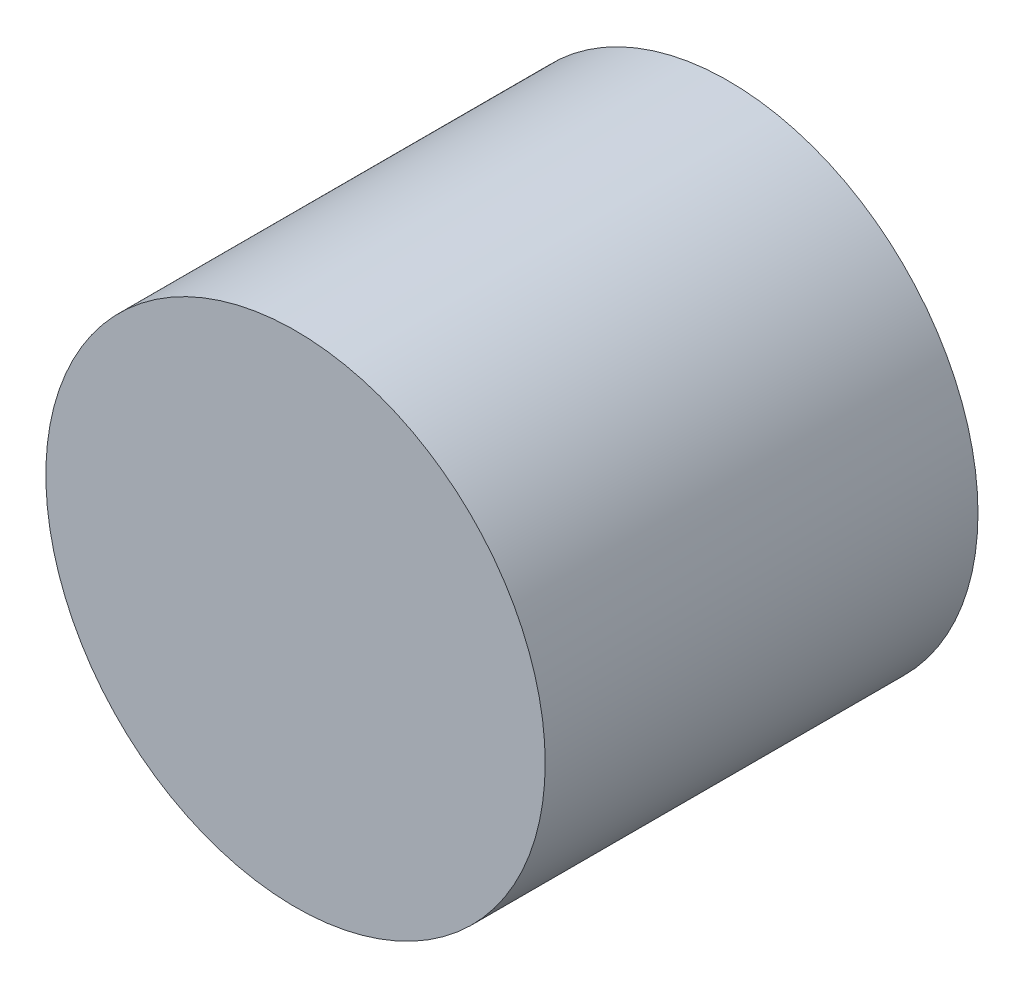
ISO-10303-21;
HEADER;
FILE_DESCRIPTION(('STEP AP214'),'2;1');
FILE_NAME('part.step','',(''),(''),'','','');
FILE_SCHEMA(('AUTOMOTIVE_DESIGN { 1 0 10303 214 1 1 1 1 }'));
ENDSEC;
DATA;
#1=APPLICATION_CONTEXT('core data for automotive mechanical design processes');
#2=APPLICATION_PROTOCOL_DEFINITION('international standard','automotive_design',2000,#1);
#3=PRODUCT_CONTEXT('',#1,'mechanical');
#4=PRODUCT('Part','Part','',(#3));
#5=PRODUCT_RELATED_PRODUCT_CATEGORY('part','',(#4));
#6=PRODUCT_DEFINITION_FORMATION('','',#4);
#7=PRODUCT_DEFINITION_CONTEXT('part definition',#1,'design');
#8=PRODUCT_DEFINITION('design','',#6,#7);
#9=PRODUCT_DEFINITION_SHAPE('','',#8);
#10=(LENGTH_UNIT() NAMED_UNIT(*) SI_UNIT(.MILLI.,.METRE.));
#11=(NAMED_UNIT(*) PLANE_ANGLE_UNIT() SI_UNIT($,.RADIAN.));
#12=(NAMED_UNIT(*) SI_UNIT($,.STERADIAN.) SOLID_ANGLE_UNIT());
#13=UNCERTAINTY_MEASURE_WITH_UNIT(LENGTH_MEASURE(1.E-05),#10,'distance_accuracy_value','');
#14=(GEOMETRIC_REPRESENTATION_CONTEXT(3) GLOBAL_UNCERTAINTY_ASSIGNED_CONTEXT((#13)) GLOBAL_UNIT_ASSIGNED_CONTEXT((#10,
#11,#12)) REPRESENTATION_CONTEXT('',''));
#15=CARTESIAN_POINT('',(0.,0.,0.));
#16=DIRECTION('',(0.,0.,1.));
#17=DIRECTION('',(1.,0.,0.));
#18=AXIS2_PLACEMENT_3D('',#15,#16,#17);
#19=CARTESIAN_POINT('',(0.,0.,26.));
#20=DIRECTION('',(0.,0.,-1.));
#21=DIRECTION('',(-1.,0.,0.));
#22=AXIS2_PLACEMENT_3D('',#19,#20,#21);
#23=CYLINDRICAL_SURFACE('',#22,15.);
#24=CARTESIAN_POINT('',(-15.,0.,16.142557715492));
#25=CARTESIAN_POINT('',(-14.9999969274261,-0.1667307203779,16.142551581997));
#26=CARTESIAN_POINT('',(-14.9971915553469,-0.333538980604567,16.1286111865891));
#27=CARTESIAN_POINT('',(-14.9862709686969,-0.662440523067058,16.0732622151463));
#28=CARTESIAN_POINT('',(-14.9781515358056,-0.824529952624067,16.0318318170875));
#29=CARTESIAN_POINT('',(-14.9575094783486,-1.13919091578994,15.9228338946296));
#30=CARTESIAN_POINT('',(-14.9449910723015,-1.2917714037994,15.8552914049579));
#31=CARTESIAN_POINT('',(-14.9169119410594,-1.58342396659268,15.6960609729581));
#32=CARTESIAN_POINT('',(-14.9013513970712,-1.72249684522744,15.6043744686704));
#33=CARTESIAN_POINT('',(-14.8686649598991,-1.98508043194459,15.3981422326177));
#34=CARTESIAN_POINT('',(-14.8515223651304,-2.10838185347557,15.2833326493184));
#35=CARTESIAN_POINT('',(-14.8177254135776,-2.33411026982408,15.0346804663169));
#36=CARTESIAN_POINT('',(-14.8010710950127,-2.43653563431127,14.9008363814866));
#37=CARTESIAN_POINT('',(-14.7699732543785,-2.61849526004286,14.6164091364564));
#38=CARTESIAN_POINT('',(-14.7555512209484,-2.6978128165976,14.4656847841029));
#39=CARTESIAN_POINT('',(-14.7307880417525,-2.82991699974092,14.1527122584798));
#40=CARTESIAN_POINT('',(-14.7204464928588,-2.88270624731171,13.990465225453));
#41=CARTESIAN_POINT('',(-14.7051841575661,-2.95957589965448,13.6613046237682));
#42=CARTESIAN_POINT('',(-14.7001941032156,-2.98402349387633,13.4944800830653));
#43=CARTESIAN_POINT('',(-14.6959912518188,-3.00465638317836,13.159028251399));
#44=CARTESIAN_POINT('',(-14.6967778640352,-3.0008445681405,12.9904011465316));
#45=CARTESIAN_POINT('',(-14.7039765344455,-2.96536371930546,12.658817351429));
#46=CARTESIAN_POINT('',(-14.7103035857629,-2.93411562073172,12.4958134986101));
#47=CARTESIAN_POINT('',(-14.7277363848,-2.84531365386915,12.177409485503));
#48=CARTESIAN_POINT('',(-14.7388423607334,-2.78775852930204,12.022009688735));
#49=CARTESIAN_POINT('',(-14.7646685550122,-2.64757435102416,11.7220119303812));
#50=CARTESIAN_POINT('',(-14.7794126944111,-2.56477845369634,11.5774940767845));
#51=CARTESIAN_POINT('',(-14.8108385631919,-2.37658072371804,11.3042451655736));
#52=CARTESIAN_POINT('',(-14.827520515151,-2.27117629307049,11.1755159249385));
#53=CARTESIAN_POINT('',(-14.8613106372439,-2.03849980368175,10.9350695081212));
#54=CARTESIAN_POINT('',(-14.8784210763271,-1.91086848363733,10.8237000119146));
#55=CARTESIAN_POINT('',(-14.9108654614323,-1.63855507218603,10.6238961765883));
#56=CARTESIAN_POINT('',(-14.9261993846692,-1.49387276213817,10.5354621316113));
#57=CARTESIAN_POINT('',(-14.9534007048266,-1.19117816063676,10.3839751878141));
#58=CARTESIAN_POINT('',(-14.9652626654482,-1.0331454587559,10.3209620345584));
#59=CARTESIAN_POINT('',(-14.9841422696357,-0.708446929345994,10.2224762933763));
#60=CARTESIAN_POINT('',(-14.9911605000159,-0.541782150217348,10.1870003692711));
#61=CARTESIAN_POINT('',(-14.999480156006,-0.20753821688145,10.1450883541092));
#62=CARTESIAN_POINT('',(-15.0008752395741,-0.0400209849767272,10.1381764568712));
#63=CARTESIAN_POINT('',(-14.9980515579031,0.293774802578143,10.1523072923185));
#64=CARTESIAN_POINT('',(-14.9938331082434,0.46005342733138,10.1733484535498));
#65=CARTESIAN_POINT('',(-14.9803149602405,0.785116979839622,10.2423928361239));
#66=CARTESIAN_POINT('',(-14.9710612921262,0.943955845019709,10.2901519209857));
#67=CARTESIAN_POINT('',(-14.948506561831,1.251370882499,10.4110096634594));
#68=CARTESIAN_POINT('',(-14.9352051964268,1.39994628491262,10.4841102195225));
#69=CARTESIAN_POINT('',(-14.9057973459988,1.68462352105865,10.6546051874459));
#70=CARTESIAN_POINT('',(-14.8896585131116,1.82055038025656,10.7522860586088));
#71=CARTESIAN_POINT('',(-14.8564420448965,2.07425405735762,10.9687852891138));
#72=CARTESIAN_POINT('',(-14.8393643090516,2.19202892679229,11.0876059146916));
#73=CARTESIAN_POINT('',(-14.8058791067089,2.40792177232253,11.3451777711654));
#74=CARTESIAN_POINT('',(-14.7894858069991,2.50571310734596,11.484204948156));
#75=CARTESIAN_POINT('',(-14.7595257538858,2.67655626015362,11.776991799562));
#76=CARTESIAN_POINT('',(-14.7459588874003,2.74960906776871,11.9307508842127));
#77=CARTESIAN_POINT('',(-14.7233022175315,2.86845552474588,12.2478624539406));
#78=CARTESIAN_POINT('',(-14.7141892461656,2.91439049937315,12.411160239123));
#79=CARTESIAN_POINT('',(-14.7014231037608,2.97812595488159,12.7433580759647));
#80=CARTESIAN_POINT('',(-14.6977692207333,2.99593010467534,12.91225739412));
#81=CARTESIAN_POINT('',(-14.6963744889414,3.0027627326024,13.247584309125));
#82=CARTESIAN_POINT('',(-14.698527575679,2.99230736421269,13.414001162273));
#83=CARTESIAN_POINT('',(-14.7082672045384,2.94405691230018,13.7426526652071));
#84=CARTESIAN_POINT('',(-14.7158537030151,2.90626204838789,13.9048873485764));
#85=CARTESIAN_POINT('',(-14.7355579265748,2.80463570549686,14.2202408492136));
#86=CARTESIAN_POINT('',(-14.7476646305649,2.74086752015203,14.3733807969992));
#87=CARTESIAN_POINT('',(-14.7750514492251,2.58916393380481,14.6668688776953));
#88=CARTESIAN_POINT('',(-14.7903318299668,2.50122650632465,14.8072159366674));
#89=CARTESIAN_POINT('',(-14.8226688156968,2.30191774435924,15.0737044319429));
#90=CARTESIAN_POINT('',(-14.839751187291,2.19017366170554,15.1995640112948));
#91=CARTESIAN_POINT('',(-14.8735824561586,1.94719310703942,15.4309163320795));
#92=CARTESIAN_POINT('',(-14.8903312758955,1.81595216146001,15.5364043864438));
#93=CARTESIAN_POINT('',(-14.9218149716391,1.53605288726474,15.7250616473313));
#94=CARTESIAN_POINT('',(-14.9365269365774,1.38722665328951,15.8079857253321));
#95=CARTESIAN_POINT('',(-14.96205375255,1.0774990828222,15.9475160832818));
#96=CARTESIAN_POINT('',(-14.9728721141585,0.916608782589379,16.0041460840895));
#97=CARTESIAN_POINT('',(-14.9872911778611,0.629464466771338,16.0785135596261));
#98=CARTESIAN_POINT('',(-14.9920290947535,0.504844992041353,16.1024872966153));
#99=CARTESIAN_POINT('',(-14.9983846241968,0.253498575630201,16.1345114525671));
#100=CARTESIAN_POINT('',(-15.0000023361946,0.126771701245857,16.1425623790213));
#101=CARTESIAN_POINT('',(-15.,0.,16.142557715492));
#102=B_SPLINE_CURVE_WITH_KNOTS('',3,(#24,#25,#26,#27,#28,#29,#30,#31,#32,#33,#34,#35,#36,#37,
#38,#39,#40,#41,#42,#43,#44,#45,#46,#47,#48,#49,#50,#51,#52,#53,#54,#55,#56,#57,#58,#59,#60,#61,
#62,#63,#64,#65,#66,#67,#68,#69,#70,#71,#72,#73,#74,#75,#76,#77,#78,#79,#80,#81,#82,#83,#84,#85,
#86,#87,#88,#89,#90,#91,#92,#93,#94,#95,#96,#97,#98,#99,#100,#101),.UNSPECIFIED.,.T.,.F.,(4,2,2,
2,2,2,2,2,2,2,2,2,2,2,2,2,2,2,2,2,2,2,2,2,2,2,2,2,2,2,2,2,2,2,2,2,2,2,4),(0.,0.499728391983775,
0.999853952073969,1.49950120575102,1.99911870669259,2.50479801033656,3.0105167902421,
3.52083585017768,4.03110448095592,4.53468555310762,5.03821512843675,5.53415181018835,
6.03011217761189,6.52942470610777,7.02879464249011,7.53714757474052,8.04550702619461,
8.55465824562071,9.06374777094108,9.56432207028795,10.064868229736,10.5609136185217,
11.0569961764807,11.5591519810008,12.0613616503779,12.5712188573768,13.081055661704,
13.5882114309817,14.0953010499124,14.593191677031,15.0910783047782,15.5877588375933,
16.084481027456,16.5896422871743,17.0949196359879,17.6054849002691,18.1155886655256,
18.4955632586968,18.8755257411299),.UNSPECIFIED.);
#103=CARTESIAN_POINT('',(-15.,0.,16.142557715492));
#104=VERTEX_POINT('',#103);
#105=EDGE_CURVE('E38',#104,#104,#102,.T.);
#106=ORIENTED_EDGE('',*,*,#105,.T.);
#107=EDGE_LOOP('',(#106));
#108=FACE_BOUND('',#107,.T.);
#109=CARTESIAN_POINT('',(0.,0.,26.));
#110=DIRECTION('',(0.,0.,1.));
#111=DIRECTION('',(1.,0.,0.));
#112=AXIS2_PLACEMENT_3D('',#109,#110,#111);
#113=CIRCLE('',#112,15.);
#114=CARTESIAN_POINT('',(15.,0.,26.));
#115=VERTEX_POINT('',#114);
#116=EDGE_CURVE('E10',#115,#115,#113,.T.);
#117=ORIENTED_EDGE('',*,*,#116,.F.);
#118=EDGE_LOOP('',(#117));
#119=FACE_BOUND('',#118,.T.);
#120=CARTESIAN_POINT('',(0.,0.,0.));
#121=DIRECTION('',(0.,0.,1.));
#122=DIRECTION('',(1.,0.,0.));
#123=AXIS2_PLACEMENT_3D('',#120,#121,#122);
#124=CIRCLE('',#123,15.);
#125=CARTESIAN_POINT('',(15.,0.,0.));
#126=VERTEX_POINT('',#125);
#127=EDGE_CURVE('E46',#126,#126,#124,.T.);
#128=ORIENTED_EDGE('',*,*,#127,.T.);
#129=EDGE_LOOP('',(#128));
#130=FACE_BOUND('',#129,.T.);
#131=ADVANCED_FACE('F34',(#108,#119,#130),#23,.T.);
#132=CARTESIAN_POINT('',(0.,0.,26.));
#133=DIRECTION('',(0.,0.,1.));
#134=DIRECTION('',(1.,0.,0.));
#135=AXIS2_PLACEMENT_3D('',#132,#133,#134);
#136=PLANE('',#135);
#137=ORIENTED_EDGE('',*,*,#116,.T.);
#138=EDGE_LOOP('',(#137));
#139=FACE_BOUND('',#138,.T.);
#140=ADVANCED_FACE('F71',(#139),#136,.T.);
#141=CARTESIAN_POINT('',(0.,0.,0.));
#142=DIRECTION('',(0.,0.,1.));
#143=DIRECTION('',(1.,0.,0.));
#144=AXIS2_PLACEMENT_3D('',#141,#142,#143);
#145=PLANE('',#144);
#146=ORIENTED_EDGE('',*,*,#127,.F.);
#147=EDGE_LOOP('',(#146));
#148=FACE_BOUND('',#147,.T.);
#149=ADVANCED_FACE('F64',(#148),#145,.F.);
#150=CARTESIAN_POINT('',(-23.5,0.,13.142557715492));
#151=DIRECTION('',(1.,0.,0.));
#152=DIRECTION('',(0.,0.,-1.));
#153=AXIS2_PLACEMENT_3D('',#150,#151,#152);
#154=CYLINDRICAL_SURFACE('',#153,3.);
#155=CARTESIAN_POINT('',(0.,0.,13.142557715492));
#156=DIRECTION('',(1.,0.,0.));
#157=DIRECTION('',(0.,0.,-1.));
#158=AXIS2_PLACEMENT_3D('',#155,#156,#157);
#159=CIRCLE('',#158,3.);
#160=CARTESIAN_POINT('',(0.,0.,10.142557715492));
#161=VERTEX_POINT('',#160);
#162=EDGE_CURVE('E52',#161,#161,#159,.T.);
#163=ORIENTED_EDGE('',*,*,#162,.T.);
#164=EDGE_LOOP('',(#163));
#165=FACE_BOUND('',#164,.T.);
#166=ORIENTED_EDGE('',*,*,#105,.F.);
#167=EDGE_LOOP('',(#166));
#168=FACE_BOUND('',#167,.T.);
#169=ADVANCED_FACE('F61',(#165,#168),#154,.F.);
#170=CARTESIAN_POINT('',(0.,0.,13.142557715492));
#171=DIRECTION('',(1.,0.,0.));
#172=DIRECTION('',(0.,0.,-1.));
#173=AXIS2_PLACEMENT_3D('',#170,#171,#172);
#174=PLANE('',#173);
#175=ORIENTED_EDGE('',*,*,#162,.F.);
#176=EDGE_LOOP('',(#175));
#177=FACE_BOUND('',#176,.T.);
#178=ADVANCED_FACE('F63',(#177),#174,.F.);
#179=CLOSED_SHELL('',(#131,#140,#149,#169,#178));
#180=MANIFOLD_SOLID_BREP('B2',#179);
#181=ADVANCED_BREP_SHAPE_REPRESENTATION('',(#18,#180),#14);
#182=SHAPE_DEFINITION_REPRESENTATION(#9,#181);
ENDSEC;
END-ISO-10303-21;
